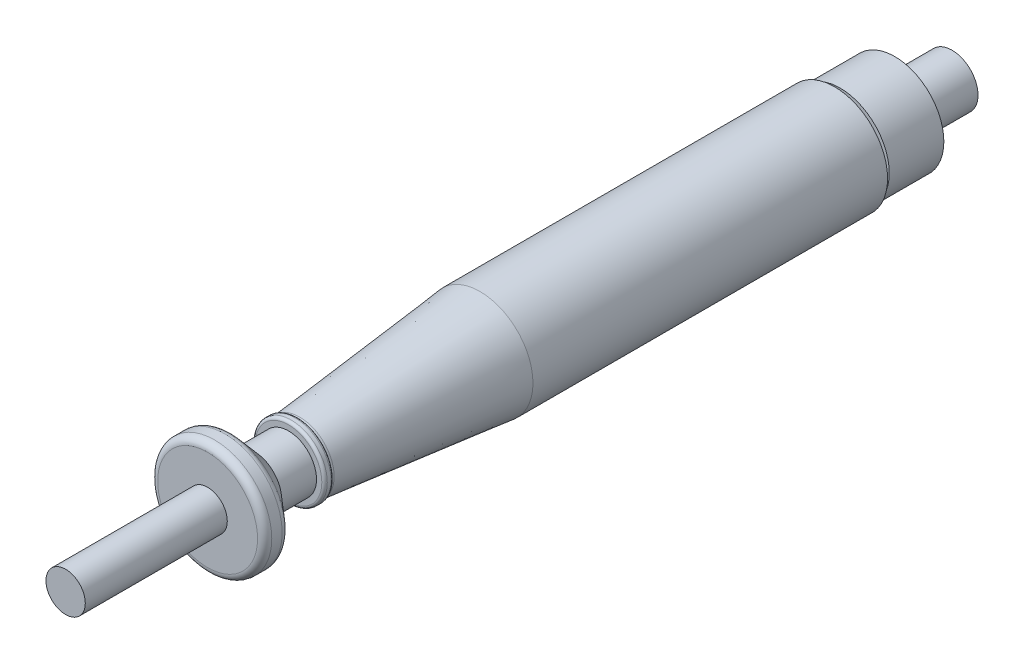
ISO-10303-21;
HEADER;
FILE_DESCRIPTION(('STEP AP214'),'2;1');
FILE_NAME('part.step','',(''),(''),'','','');
FILE_SCHEMA(('AUTOMOTIVE_DESIGN { 1 0 10303 214 1 1 1 1 }'));
ENDSEC;
DATA;
#1=APPLICATION_CONTEXT('core data for automotive mechanical design processes');
#2=APPLICATION_PROTOCOL_DEFINITION('international standard','automotive_design',2000,#1);
#3=PRODUCT_CONTEXT('',#1,'mechanical');
#4=PRODUCT('Part','Part','',(#3));
#5=PRODUCT_RELATED_PRODUCT_CATEGORY('part','',(#4));
#6=PRODUCT_DEFINITION_FORMATION('','',#4);
#7=PRODUCT_DEFINITION_CONTEXT('part definition',#1,'design');
#8=PRODUCT_DEFINITION('design','',#6,#7);
#9=PRODUCT_DEFINITION_SHAPE('','',#8);
#10=(LENGTH_UNIT() NAMED_UNIT(*) SI_UNIT(.MILLI.,.METRE.));
#11=(NAMED_UNIT(*) PLANE_ANGLE_UNIT() SI_UNIT($,.RADIAN.));
#12=(NAMED_UNIT(*) SI_UNIT($,.STERADIAN.) SOLID_ANGLE_UNIT());
#13=UNCERTAINTY_MEASURE_WITH_UNIT(LENGTH_MEASURE(1.E-05),#10,'distance_accuracy_value','');
#14=(GEOMETRIC_REPRESENTATION_CONTEXT(3) GLOBAL_UNCERTAINTY_ASSIGNED_CONTEXT((#13)) GLOBAL_UNIT_ASSIGNED_CONTEXT((#10,
#11,#12)) REPRESENTATION_CONTEXT('',''));
#15=CARTESIAN_POINT('',(0.,0.,0.));
#16=DIRECTION('',(0.,0.,1.));
#17=DIRECTION('',(1.,0.,0.));
#18=AXIS2_PLACEMENT_3D('',#15,#16,#17);
#19=CARTESIAN_POINT('',(0.,0.,154.305));
#20=DIRECTION('',(0.,0.,-1.));
#21=DIRECTION('',(-1.,0.,0.));
#22=AXIS2_PLACEMENT_3D('',#19,#20,#21);
#23=CYLINDRICAL_SURFACE('',#22,7.98195);
#24=CARTESIAN_POINT('',(0.,0.,151.673417639268));
#25=DIRECTION('',(0.,0.,-1.));
#26=DIRECTION('',(-1.,0.,0.));
#27=AXIS2_PLACEMENT_3D('',#24,#25,#26);
#28=CIRCLE('',#27,7.98195);
#29=CARTESIAN_POINT('',(-7.98195,0.,151.673417639268));
#30=VERTEX_POINT('',#29);
#31=EDGE_CURVE('E66',#30,#30,#28,.T.);
#32=ORIENTED_EDGE('',*,*,#31,.F.);
#33=EDGE_LOOP('',(#32));
#34=FACE_BOUND('',#33,.T.);
#35=CARTESIAN_POINT('',(0.,0.,152.2095));
#36=DIRECTION('',(0.,0.,1.));
#37=DIRECTION('',(1.,0.,0.));
#38=AXIS2_PLACEMENT_3D('',#35,#36,#37);
#39=CIRCLE('',#38,7.98195);
#40=CARTESIAN_POINT('',(7.98195,0.,152.2095));
#41=VERTEX_POINT('',#40);
#42=EDGE_CURVE('E63',#41,#41,#39,.T.);
#43=ORIENTED_EDGE('',*,*,#42,.F.);
#44=EDGE_LOOP('',(#43));
#45=FACE_BOUND('',#44,.T.);
#46=ADVANCED_FACE('F34',(#34,#45),#23,.T.);
#47=CARTESIAN_POINT('',(0.,0.,13.335));
#48=DIRECTION('',(0.,0.,-1.));
#49=DIRECTION('',(-1.,0.,0.));
#50=AXIS2_PLACEMENT_3D('',#47,#48,#49);
#51=CYLINDRICAL_SURFACE('',#50,6.0325);
#52=CARTESIAN_POINT('',(0.,0.,13.335));
#53=DIRECTION('',(0.,0.,1.));
#54=DIRECTION('',(1.,0.,0.));
#55=AXIS2_PLACEMENT_3D('',#52,#53,#54);
#56=CIRCLE('',#55,6.0325);
#57=CARTESIAN_POINT('',(6.0325,0.,13.335));
#58=VERTEX_POINT('',#57);
#59=EDGE_CURVE('E70',#58,#58,#56,.T.);
#60=ORIENTED_EDGE('',*,*,#59,.F.);
#61=EDGE_LOOP('',(#60));
#62=FACE_BOUND('',#61,.T.);
#63=CARTESIAN_POINT('',(0.,0.,0.));
#64=DIRECTION('',(0.,0.,1.));
#65=DIRECTION('',(1.,0.,0.));
#66=AXIS2_PLACEMENT_3D('',#63,#64,#65);
#67=CIRCLE('',#66,6.0325);
#68=CARTESIAN_POINT('',(6.0325,0.,0.));
#69=VERTEX_POINT('',#68);
#70=EDGE_CURVE('E67',#69,#69,#67,.T.);
#71=ORIENTED_EDGE('',*,*,#70,.T.);
#72=EDGE_LOOP('',(#71));
#73=FACE_BOUND('',#72,.T.);
#74=ADVANCED_FACE('F128',(#62,#73),#51,.T.);
#75=CARTESIAN_POINT('',(0.,0.,0.));
#76=DIRECTION('',(0.,0.,1.));
#77=DIRECTION('',(1.,0.,0.));
#78=AXIS2_PLACEMENT_3D('',#75,#76,#77);
#79=PLANE('',#78);
#80=ORIENTED_EDGE('',*,*,#70,.F.);
#81=EDGE_LOOP('',(#80));
#82=FACE_BOUND('',#81,.T.);
#83=ADVANCED_FACE('F134',(#82),#79,.F.);
#84=CARTESIAN_POINT('',(0.,0.,26.035));
#85=DIRECTION('',(0.,0.,-1.));
#86=DIRECTION('',(-1.,0.,0.));
#87=AXIS2_PLACEMENT_3D('',#84,#85,#86);
#88=CYLINDRICAL_SURFACE('',#87,11.43);
#89=CARTESIAN_POINT('',(0.,0.,26.035));
#90=DIRECTION('',(0.,0.,1.));
#91=DIRECTION('',(1.,0.,0.));
#92=AXIS2_PLACEMENT_3D('',#89,#90,#91);
#93=CIRCLE('',#92,11.43);
#94=CARTESIAN_POINT('',(11.43,0.,26.035));
#95=VERTEX_POINT('',#94);
#96=EDGE_CURVE('E71',#95,#95,#93,.T.);
#97=ORIENTED_EDGE('',*,*,#96,.F.);
#98=EDGE_LOOP('',(#97));
#99=FACE_BOUND('',#98,.T.);
#100=CARTESIAN_POINT('',(0.,0.,13.335));
#101=DIRECTION('',(0.,0.,1.));
#102=DIRECTION('',(1.,0.,0.));
#103=AXIS2_PLACEMENT_3D('',#100,#101,#102);
#104=CIRCLE('',#103,11.43);
#105=CARTESIAN_POINT('',(11.43,0.,13.335));
#106=VERTEX_POINT('',#105);
#107=EDGE_CURVE('E74',#106,#106,#104,.T.);
#108=ORIENTED_EDGE('',*,*,#107,.T.);
#109=EDGE_LOOP('',(#108));
#110=FACE_BOUND('',#109,.T.);
#111=ADVANCED_FACE('F160',(#99,#110),#88,.T.);
#112=CARTESIAN_POINT('',(0.,0.,26.035));
#113=DIRECTION('',(0.,0.,1.));
#114=DIRECTION('',(1.,0.,0.));
#115=AXIS2_PLACEMENT_3D('',#112,#113,#114);
#116=PLANE('',#115);
#117=CARTESIAN_POINT('',(0.,0.,26.035));
#118=DIRECTION('',(0.,0.,1.));
#119=DIRECTION('',(1.,0.,0.));
#120=AXIS2_PLACEMENT_3D('',#117,#118,#119);
#121=CIRCLE('',#120,10.16);
#122=CARTESIAN_POINT('',(10.16,0.,26.035));
#123=VERTEX_POINT('',#122);
#124=EDGE_CURVE('E80',#123,#123,#121,.T.);
#125=ORIENTED_EDGE('',*,*,#124,.F.);
#126=EDGE_LOOP('',(#125));
#127=FACE_BOUND('',#126,.T.);
#128=ORIENTED_EDGE('',*,*,#96,.T.);
#129=EDGE_LOOP('',(#128));
#130=FACE_BOUND('',#129,.T.);
#131=ADVANCED_FACE('F157',(#127,#130),#116,.T.);
#132=CARTESIAN_POINT('',(0.,0.,13.335));
#133=DIRECTION('',(0.,0.,1.));
#134=DIRECTION('',(1.,0.,0.));
#135=AXIS2_PLACEMENT_3D('',#132,#133,#134);
#136=PLANE('',#135);
#137=ORIENTED_EDGE('',*,*,#59,.T.);
#138=EDGE_LOOP('',(#137));
#139=FACE_BOUND('',#138,.T.);
#140=ORIENTED_EDGE('',*,*,#107,.F.);
#141=EDGE_LOOP('',(#140));
#142=FACE_BOUND('',#141,.T.);
#143=ADVANCED_FACE('F155',(#139,#142),#136,.F.);
#144=CARTESIAN_POINT('',(0.,0.,27.305));
#145=DIRECTION('',(0.,0.,-1.));
#146=DIRECTION('',(-1.,0.,0.));
#147=AXIS2_PLACEMENT_3D('',#144,#145,#146);
#148=CYLINDRICAL_SURFACE('',#147,10.16);
#149=CARTESIAN_POINT('',(0.,0.,27.305));
#150=DIRECTION('',(0.,0.,1.));
#151=DIRECTION('',(1.,0.,0.));
#152=AXIS2_PLACEMENT_3D('',#149,#150,#151);
#153=CIRCLE('',#152,10.16);
#154=CARTESIAN_POINT('',(10.16,0.,27.305));
#155=VERTEX_POINT('',#154);
#156=EDGE_CURVE('E77',#155,#155,#153,.T.);
#157=ORIENTED_EDGE('',*,*,#156,.F.);
#158=EDGE_LOOP('',(#157));
#159=FACE_BOUND('',#158,.T.);
#160=ORIENTED_EDGE('',*,*,#124,.T.);
#161=EDGE_LOOP('',(#160));
#162=FACE_BOUND('',#161,.T.);
#163=ADVANCED_FACE('F151',(#159,#162),#148,.T.);
#164=CARTESIAN_POINT('',(0.,0.,109.7661));
#165=DIRECTION('',(0.,0.,-1.));
#166=DIRECTION('',(-1.,0.,0.));
#167=AXIS2_PLACEMENT_3D('',#164,#165,#166);
#168=CYLINDRICAL_SURFACE('',#167,12.31265);
#169=CARTESIAN_POINT('',(0.,0.,109.7661));
#170=DIRECTION('',(0.,0.,1.));
#171=DIRECTION('',(1.,0.,0.));
#172=AXIS2_PLACEMENT_3D('',#169,#170,#171);
#173=CIRCLE('',#172,12.31265);
#174=CARTESIAN_POINT('',(12.31265,0.,109.7661));
#175=VERTEX_POINT('',#174);
#176=EDGE_CURVE('E83',#175,#175,#173,.T.);
#177=ORIENTED_EDGE('',*,*,#176,.F.);
#178=EDGE_LOOP('',(#177));
#179=FACE_BOUND('',#178,.T.);
#180=CARTESIAN_POINT('',(0.,0.,27.305));
#181=DIRECTION('',(0.,0.,1.));
#182=DIRECTION('',(1.,0.,0.));
#183=AXIS2_PLACEMENT_3D('',#180,#181,#182);
#184=CIRCLE('',#183,12.31265);
#185=CARTESIAN_POINT('',(12.31265,0.,27.305));
#186=VERTEX_POINT('',#185);
#187=EDGE_CURVE('E86',#186,#186,#184,.T.);
#188=ORIENTED_EDGE('',*,*,#187,.T.);
#189=EDGE_LOOP('',(#188));
#190=FACE_BOUND('',#189,.T.);
#191=ADVANCED_FACE('F147',(#179,#190),#168,.T.);
#192=CARTESIAN_POINT('',(0.,0.,27.305));
#193=DIRECTION('',(0.,0.,1.));
#194=DIRECTION('',(1.,0.,0.));
#195=AXIS2_PLACEMENT_3D('',#192,#193,#194);
#196=PLANE('',#195);
#197=ORIENTED_EDGE('',*,*,#156,.T.);
#198=EDGE_LOOP('',(#197));
#199=FACE_BOUND('',#198,.T.);
#200=ORIENTED_EDGE('',*,*,#187,.F.);
#201=EDGE_LOOP('',(#200));
#202=FACE_BOUND('',#201,.T.);
#203=ADVANCED_FACE('F143',(#199,#202),#196,.F.);
#204=CARTESIAN_POINT('',(0.,0.,109.7661));
#205=DIRECTION('',(0.,0.,-1.));
#206=DIRECTION('',(1.,0.,0.));
#207=AXIS2_PLACEMENT_3D('',#204,#205,#206);
#208=CONICAL_SURFACE('',#207,12.31265,0.102974425867666);
#209=ORIENTED_EDGE('',*,*,#176,.T.);
#210=EDGE_LOOP('',(#209));
#211=FACE_BOUND('',#210,.T.);
#212=ORIENTED_EDGE('',*,*,#31,.T.);
#213=EDGE_LOOP('',(#212));
#214=FACE_BOUND('',#213,.T.);
#215=ADVANCED_FACE('F146',(#211,#214),#208,.T.);
#216=CARTESIAN_POINT('',(0.,0.,152.2095));
#217=DIRECTION('',(0.,0.,1.));
#218=DIRECTION('',(1.,0.,0.));
#219=AXIS2_PLACEMENT_3D('',#216,#217,#218);
#220=CYLINDRICAL_SURFACE('',#219,8.382);
#221=CARTESIAN_POINT('',(0.,0.,152.79943516381));
#222=DIRECTION('',(0.,0.,-1.));
#223=DIRECTION('',(-1.,0.,0.));
#224=AXIS2_PLACEMENT_3D('',#221,#222,#223);
#225=CIRCLE('',#224,8.382);
#226=CARTESIAN_POINT('',(-8.382,0.,152.79943516381));
#227=VERTEX_POINT('',#226);
#228=EDGE_CURVE('E57',#227,#227,#225,.F.);
#229=ORIENTED_EDGE('',*,*,#228,.T.);
#230=EDGE_LOOP('',(#229));
#231=FACE_BOUND('',#230,.T.);
#232=CARTESIAN_POINT('',(0.,0.,153.67));
#233=DIRECTION('',(0.,0.,1.));
#234=DIRECTION('',(1.,0.,0.));
#235=AXIS2_PLACEMENT_3D('',#232,#233,#234);
#236=CIRCLE('',#235,8.382);
#237=CARTESIAN_POINT('',(8.382,0.,153.67));
#238=VERTEX_POINT('',#237);
#239=EDGE_CURVE('E60',#238,#238,#236,.F.);
#240=ORIENTED_EDGE('',*,*,#239,.T.);
#241=EDGE_LOOP('',(#240));
#242=FACE_BOUND('',#241,.T.);
#243=ADVANCED_FACE('F189',(#231,#242),#220,.T.);
#244=CARTESIAN_POINT('',(0.,0.,154.305));
#245=DIRECTION('',(0.,0.,1.));
#246=DIRECTION('',(1.,0.,0.));
#247=AXIS2_PLACEMENT_3D('',#244,#245,#246);
#248=PLANE('',#247);
#249=CARTESIAN_POINT('',(0.,0.,154.305));
#250=DIRECTION('',(0.,0.,1.));
#251=DIRECTION('',(1.,0.,0.));
#252=AXIS2_PLACEMENT_3D('',#249,#250,#251);
#253=CIRCLE('',#252,6.5151);
#254=CARTESIAN_POINT('',(6.5151,0.,154.305));
#255=VERTEX_POINT('',#254);
#256=EDGE_CURVE('E94',#255,#255,#253,.T.);
#257=ORIENTED_EDGE('',*,*,#256,.F.);
#258=EDGE_LOOP('',(#257));
#259=FACE_BOUND('',#258,.T.);
#260=CARTESIAN_POINT('',(0.,0.,154.305));
#261=DIRECTION('',(0.,0.,1.));
#262=DIRECTION('',(1.,0.,0.));
#263=AXIS2_PLACEMENT_3D('',#260,#261,#262);
#264=CIRCLE('',#263,7.747);
#265=CARTESIAN_POINT('',(7.747,0.,154.305));
#266=VERTEX_POINT('',#265);
#267=EDGE_CURVE('E54',#266,#266,#264,.T.);
#268=ORIENTED_EDGE('',*,*,#267,.T.);
#269=EDGE_LOOP('',(#268));
#270=FACE_BOUND('',#269,.T.);
#271=ADVANCED_FACE('F141',(#259,#270),#248,.T.);
#272=CARTESIAN_POINT('',(0.,0.,152.79943516381));
#273=DIRECTION('',(0.,0.,-1.));
#274=DIRECTION('',(-1.,0.,0.));
#275=AXIS2_PLACEMENT_3D('',#272,#273,#274);
#276=TOROIDAL_SURFACE('',#275,7.747,0.635);
#277=ORIENTED_EDGE('',*,*,#42,.T.);
#278=EDGE_LOOP('',(#277));
#279=FACE_BOUND('',#278,.T.);
#280=ORIENTED_EDGE('',*,*,#228,.F.);
#281=EDGE_LOOP('',(#280));
#282=FACE_BOUND('',#281,.T.);
#283=ADVANCED_FACE('F171',(#279,#282),#276,.T.);
#284=CARTESIAN_POINT('',(0.,0.,153.67));
#285=DIRECTION('',(0.,0.,1.));
#286=DIRECTION('',(1.,0.,0.));
#287=AXIS2_PLACEMENT_3D('',#284,#285,#286);
#288=TOROIDAL_SURFACE('',#287,7.747,0.635);
#289=ORIENTED_EDGE('',*,*,#239,.F.);
#290=EDGE_LOOP('',(#289));
#291=FACE_BOUND('',#290,.T.);
#292=ORIENTED_EDGE('',*,*,#267,.F.);
#293=EDGE_LOOP('',(#292));
#294=FACE_BOUND('',#293,.T.);
#295=ADVANCED_FACE('F174',(#291,#294),#288,.T.);
#296=CARTESIAN_POINT('',(0.,0.,162.4076));
#297=DIRECTION('',(0.,0.,-1.));
#298=DIRECTION('',(-1.,0.,0.));
#299=AXIS2_PLACEMENT_3D('',#296,#297,#298);
#300=CYLINDRICAL_SURFACE('',#299,6.5151);
#301=CARTESIAN_POINT('',(0.,0.,162.4076));
#302=DIRECTION('',(0.,0.,1.));
#303=DIRECTION('',(1.,0.,0.));
#304=AXIS2_PLACEMENT_3D('',#301,#302,#303);
#305=CIRCLE('',#304,6.5151);
#306=CARTESIAN_POINT('',(6.5151,0.,162.4076));
#307=VERTEX_POINT('',#306);
#308=EDGE_CURVE('E89',#307,#307,#305,.T.);
#309=ORIENTED_EDGE('',*,*,#308,.F.);
#310=EDGE_LOOP('',(#309));
#311=FACE_BOUND('',#310,.T.);
#312=ORIENTED_EDGE('',*,*,#256,.T.);
#313=EDGE_LOOP('',(#312));
#314=FACE_BOUND('',#313,.T.);
#315=ADVANCED_FACE('F177',(#311,#314),#300,.T.);
#316=CARTESIAN_POINT('',(0.,0.,162.4076));
#317=DIRECTION('',(0.,0.,1.));
#318=DIRECTION('',(1.,0.,0.));
#319=AXIS2_PLACEMENT_3D('',#316,#317,#318);
#320=CONICAL_SURFACE('',#319,6.5151,0.853466004225229);
#321=CARTESIAN_POINT('',(0.,0.,167.802575503792));
#322=DIRECTION('',(0.,0.,-1.));
#323=DIRECTION('',(-1.,0.,0.));
#324=AXIS2_PLACEMENT_3D('',#321,#322,#323);
#325=CIRCLE('',#324,12.699476530806);
#326=CARTESIAN_POINT('',(-12.699476530806,0.,167.802575503792));
#327=VERTEX_POINT('',#326);
#328=EDGE_CURVE('E41',#327,#327,#325,.T.);
#329=ORIENTED_EDGE('',*,*,#328,.T.);
#330=EDGE_LOOP('',(#329));
#331=FACE_BOUND('',#330,.T.);
#332=ORIENTED_EDGE('',*,*,#308,.T.);
#333=EDGE_LOOP('',(#332));
#334=FACE_BOUND('',#333,.T.);
#335=ADVANCED_FACE('F124',(#331,#334),#320,.T.);
#336=CARTESIAN_POINT('',(0.,0.,173.1137));
#337=DIRECTION('',(0.,0.,-1.));
#338=DIRECTION('',(-1.,0.,0.));
#339=AXIS2_PLACEMENT_3D('',#336,#337,#338);
#340=CYLINDRICAL_SURFACE('',#339,13.26515);
#341=CARTESIAN_POINT('',(0.,0.,169.046708664482));
#342=DIRECTION('',(0.,0.,-1.));
#343=DIRECTION('',(-1.,0.,0.));
#344=AXIS2_PLACEMENT_3D('',#341,#342,#343);
#345=CIRCLE('',#344,13.26515);
#346=CARTESIAN_POINT('',(-13.26515,0.,169.046708664482));
#347=VERTEX_POINT('',#346);
#348=EDGE_CURVE('E45',#347,#347,#345,.F.);
#349=ORIENTED_EDGE('',*,*,#348,.T.);
#350=EDGE_LOOP('',(#349));
#351=FACE_BOUND('',#350,.T.);
#352=CARTESIAN_POINT('',(0.,0.,171.4627));
#353=DIRECTION('',(0.,0.,1.));
#354=DIRECTION('',(1.,0.,0.));
#355=AXIS2_PLACEMENT_3D('',#352,#353,#354);
#356=CIRCLE('',#355,13.26515);
#357=CARTESIAN_POINT('',(13.26515,0.,171.4627));
#358=VERTEX_POINT('',#357);
#359=EDGE_CURVE('E49',#358,#358,#356,.F.);
#360=ORIENTED_EDGE('',*,*,#359,.T.);
#361=EDGE_LOOP('',(#360));
#362=FACE_BOUND('',#361,.T.);
#363=ADVANCED_FACE('F117',(#351,#362),#340,.T.);
#364=CARTESIAN_POINT('',(0.,0.,173.1137));
#365=DIRECTION('',(0.,0.,1.));
#366=DIRECTION('',(1.,0.,0.));
#367=AXIS2_PLACEMENT_3D('',#364,#365,#366);
#368=PLANE('',#367);
#369=CARTESIAN_POINT('',(0.,0.,173.1137));
#370=DIRECTION('',(0.,0.,1.));
#371=DIRECTION('',(1.,0.,0.));
#372=AXIS2_PLACEMENT_3D('',#369,#370,#371);
#373=CIRCLE('',#372,4.572);
#374=CARTESIAN_POINT('',(4.572,0.,173.1137));
#375=VERTEX_POINT('',#374);
#376=EDGE_CURVE('E100',#375,#375,#373,.T.);
#377=ORIENTED_EDGE('',*,*,#376,.F.);
#378=EDGE_LOOP('',(#377));
#379=FACE_BOUND('',#378,.T.);
#380=CARTESIAN_POINT('',(0.,0.,173.1137));
#381=DIRECTION('',(0.,0.,1.));
#382=DIRECTION('',(1.,0.,0.));
#383=AXIS2_PLACEMENT_3D('',#380,#381,#382);
#384=CIRCLE('',#383,11.61415);
#385=CARTESIAN_POINT('',(11.61415,0.,173.1137));
#386=VERTEX_POINT('',#385);
#387=EDGE_CURVE('E10',#386,#386,#384,.T.);
#388=ORIENTED_EDGE('',*,*,#387,.T.);
#389=EDGE_LOOP('',(#388));
#390=FACE_BOUND('',#389,.T.);
#391=ADVANCED_FACE('F114',(#379,#390),#368,.T.);
#392=CARTESIAN_POINT('',(0.,0.,169.046708664482));
#393=DIRECTION('',(0.,0.,-1.));
#394=DIRECTION('',(-1.,0.,0.));
#395=AXIS2_PLACEMENT_3D('',#392,#393,#394);
#396=TOROIDAL_SURFACE('',#395,11.61415,1.651);
#397=ORIENTED_EDGE('',*,*,#328,.F.);
#398=EDGE_LOOP('',(#397));
#399=FACE_BOUND('',#398,.T.);
#400=ORIENTED_EDGE('',*,*,#348,.F.);
#401=EDGE_LOOP('',(#400));
#402=FACE_BOUND('',#401,.T.);
#403=ADVANCED_FACE('F116',(#399,#402),#396,.T.);
#404=CARTESIAN_POINT('',(0.,0.,171.4627));
#405=DIRECTION('',(0.,0.,1.));
#406=DIRECTION('',(1.,0.,0.));
#407=AXIS2_PLACEMENT_3D('',#404,#405,#406);
#408=TOROIDAL_SURFACE('',#407,11.61415,1.651);
#409=ORIENTED_EDGE('',*,*,#359,.F.);
#410=EDGE_LOOP('',(#409));
#411=FACE_BOUND('',#410,.T.);
#412=ORIENTED_EDGE('',*,*,#387,.F.);
#413=EDGE_LOOP('',(#412));
#414=FACE_BOUND('',#413,.T.);
#415=ADVANCED_FACE('F36',(#411,#414),#408,.T.);
#416=CARTESIAN_POINT('',(0.,0.,206.1337));
#417=DIRECTION('',(0.,0.,-1.));
#418=DIRECTION('',(-1.,0.,0.));
#419=AXIS2_PLACEMENT_3D('',#416,#417,#418);
#420=CYLINDRICAL_SURFACE('',#419,4.572);
#421=CARTESIAN_POINT('',(0.,0.,206.1337));
#422=DIRECTION('',(0.,0.,1.));
#423=DIRECTION('',(1.,0.,0.));
#424=AXIS2_PLACEMENT_3D('',#421,#422,#423);
#425=CIRCLE('',#424,4.572);
#426=CARTESIAN_POINT('',(4.572,0.,206.1337));
#427=VERTEX_POINT('',#426);
#428=EDGE_CURVE('E97',#427,#427,#425,.T.);
#429=ORIENTED_EDGE('',*,*,#428,.F.);
#430=EDGE_LOOP('',(#429));
#431=FACE_BOUND('',#430,.T.);
#432=ORIENTED_EDGE('',*,*,#376,.T.);
#433=EDGE_LOOP('',(#432));
#434=FACE_BOUND('',#433,.T.);
#435=ADVANCED_FACE('F108',(#431,#434),#420,.T.);
#436=CARTESIAN_POINT('',(0.,0.,206.1337));
#437=DIRECTION('',(0.,0.,1.));
#438=DIRECTION('',(1.,0.,0.));
#439=AXIS2_PLACEMENT_3D('',#436,#437,#438);
#440=PLANE('',#439);
#441=ORIENTED_EDGE('',*,*,#428,.T.);
#442=EDGE_LOOP('',(#441));
#443=FACE_BOUND('',#442,.T.);
#444=ADVANCED_FACE('F106',(#443),#440,.T.);
#445=CLOSED_SHELL('',(#46,#74,#83,#111,#131,#143,#163,#191,#203,#215,#243,#271,#283,#295,#315,
#335,#363,#391,#403,#415,#435,#444));
#446=MANIFOLD_SOLID_BREP('B2',#445);
#447=ADVANCED_BREP_SHAPE_REPRESENTATION('',(#18,#446),#14);
#448=SHAPE_DEFINITION_REPRESENTATION(#9,#447);
ENDSEC;
END-ISO-10303-21;
